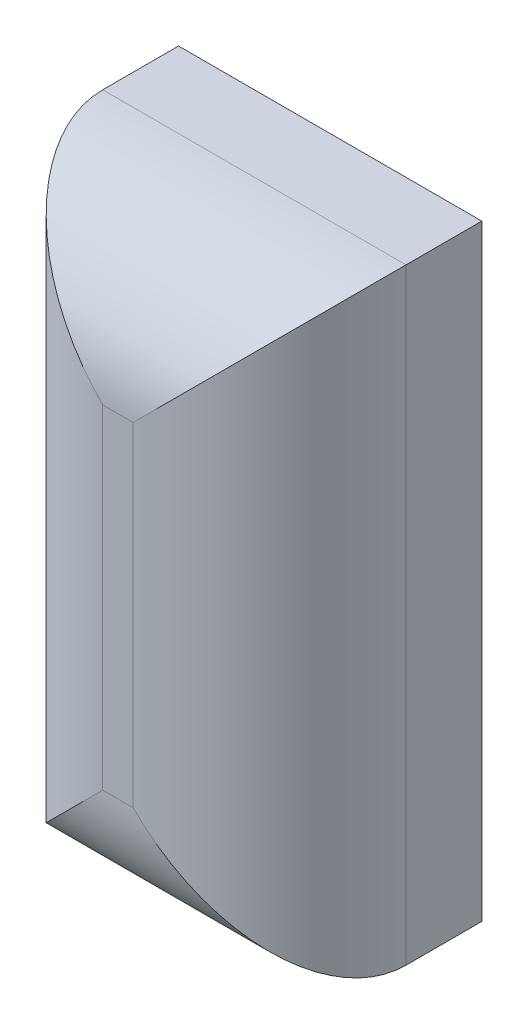
ISO-10303-21;
HEADER;
FILE_DESCRIPTION(('STEP AP214'),'2;1');
FILE_NAME('part.step','',(''),(''),'','','');
FILE_SCHEMA(('AUTOMOTIVE_DESIGN { 1 0 10303 214 1 1 1 1 }'));
ENDSEC;
DATA;
#1=APPLICATION_CONTEXT('core data for automotive mechanical design processes');
#2=APPLICATION_PROTOCOL_DEFINITION('international standard','automotive_design',2000,#1);
#3=PRODUCT_CONTEXT('',#1,'mechanical');
#4=PRODUCT('Part','Part','',(#3));
#5=PRODUCT_RELATED_PRODUCT_CATEGORY('part','',(#4));
#6=PRODUCT_DEFINITION_FORMATION('','',#4);
#7=PRODUCT_DEFINITION_CONTEXT('part definition',#1,'design');
#8=PRODUCT_DEFINITION('design','',#6,#7);
#9=PRODUCT_DEFINITION_SHAPE('','',#8);
#10=(LENGTH_UNIT() NAMED_UNIT(*) SI_UNIT(.MILLI.,.METRE.));
#11=(NAMED_UNIT(*) PLANE_ANGLE_UNIT() SI_UNIT($,.RADIAN.));
#12=(NAMED_UNIT(*) SI_UNIT($,.STERADIAN.) SOLID_ANGLE_UNIT());
#13=UNCERTAINTY_MEASURE_WITH_UNIT(LENGTH_MEASURE(1.E-05),#10,'distance_accuracy_value','');
#14=(GEOMETRIC_REPRESENTATION_CONTEXT(3) GLOBAL_UNCERTAINTY_ASSIGNED_CONTEXT((#13)) GLOBAL_UNIT_ASSIGNED_CONTEXT((#10,
#11,#12)) REPRESENTATION_CONTEXT('',''));
#15=CARTESIAN_POINT('',(0.,0.,0.));
#16=DIRECTION('',(0.,0.,1.));
#17=DIRECTION('',(1.,0.,0.));
#18=AXIS2_PLACEMENT_3D('',#15,#16,#17);
#19=CARTESIAN_POINT('',(0.,-19.5,40.3606367334853));
#20=DIRECTION('',(1.,0.,0.));
#21=DIRECTION('',(0.,1.,0.));
#22=AXIS2_PLACEMENT_3D('',#19,#20,#21);
#23=CYLINDRICAL_SURFACE('',#22,4.5);
#24=CARTESIAN_POINT('',(264.5,-19.5,40.3606367334853));
#25=DIRECTION('',(0.707106781186548,0.707106781186547,0.));
#26=DIRECTION('',(-0.707106781186547,0.707106781186548,0.));
#27=AXIS2_PLACEMENT_3D('',#24,#25,#26);
#28=ELLIPSE('',#27,6.36396103067893,4.5);
#29=CARTESIAN_POINT('',(264.5,-19.5,44.8606367334853));
#30=VERTEX_POINT('',#29);
#31=CARTESIAN_POINT('',(260.,-15.,40.3606367334853));
#32=VERTEX_POINT('',#31);
#33=EDGE_CURVE('E11',#30,#32,#28,.F.);
#34=ORIENTED_EDGE('',*,*,#33,.F.);
#35=DIRECTION('',(-1.,0.,0.));
#36=VECTOR('',#35,1.);
#37=CARTESIAN_POINT('',(0.,-19.5,44.8606367334853));
#38=LINE('',#37,#36);
#39=CARTESIAN_POINT('',(265.5,-19.5,44.8606367334853));
#40=VERTEX_POINT('',#39);
#41=EDGE_CURVE('E107',#40,#30,#38,.T.);
#42=ORIENTED_EDGE('',*,*,#41,.F.);
#43=CARTESIAN_POINT('',(265.5,-19.5,40.3606367334853));
#44=DIRECTION('',(0.707106781186547,-0.707106781186548,0.));
#45=DIRECTION('',(0.707106781186548,0.707106781186547,0.));
#46=AXIS2_PLACEMENT_3D('',#43,#44,#45);
#47=ELLIPSE('',#46,6.36396103067893,4.5);
#48=CARTESIAN_POINT('',(270.,-15.,40.3606367334853));
#49=VERTEX_POINT('',#48);
#50=EDGE_CURVE('E49',#40,#49,#47,.F.);
#51=ORIENTED_EDGE('',*,*,#50,.T.);
#52=DIRECTION('',(-1.,0.,0.));
#53=VECTOR('',#52,1.);
#54=CARTESIAN_POINT('',(0.,-15.,40.3606367334853));
#55=LINE('',#54,#53);
#56=EDGE_CURVE('E147',#32,#49,#55,.F.);
#57=ORIENTED_EDGE('',*,*,#56,.F.);
#58=EDGE_LOOP('',(#34,#42,#51,#57));
#59=FACE_BOUND('',#58,.T.);
#60=ADVANCED_FACE('F42',(#59),#23,.T.);
#61=CARTESIAN_POINT('',(265.5,0.,40.3606367334853));
#62=DIRECTION('',(0.,-1.,0.));
#63=DIRECTION('',(0.,0.,-1.));
#64=AXIS2_PLACEMENT_3D('',#61,#62,#63);
#65=CYLINDRICAL_SURFACE('',#64,4.5);
#66=ORIENTED_EDGE('',*,*,#50,.F.);
#67=DIRECTION('',(0.,1.,0.));
#68=VECTOR('',#67,1.);
#69=CARTESIAN_POINT('',(265.5,0.,44.8606367334853));
#70=LINE('',#69,#68);
#71=CARTESIAN_POINT('',(265.5,-30.5,44.8606367334853));
#72=VERTEX_POINT('',#71);
#73=EDGE_CURVE('E133',#72,#40,#70,.T.);
#74=ORIENTED_EDGE('',*,*,#73,.F.);
#75=CARTESIAN_POINT('',(265.5,-30.5,40.3606367334853));
#76=DIRECTION('',(-0.707106781186548,-0.707106781186547,0.));
#77=DIRECTION('',(0.707106781186547,-0.707106781186548,0.));
#78=AXIS2_PLACEMENT_3D('',#75,#76,#77);
#79=ELLIPSE('',#78,6.36396103067893,4.5);
#80=CARTESIAN_POINT('',(270.,-35.,40.3606367334853));
#81=VERTEX_POINT('',#80);
#82=EDGE_CURVE('E63',#72,#81,#79,.F.);
#83=ORIENTED_EDGE('',*,*,#82,.T.);
#84=DIRECTION('',(0.,1.,0.));
#85=VECTOR('',#84,1.);
#86=CARTESIAN_POINT('',(270.,0.,40.3606367334853));
#87=LINE('',#86,#85);
#88=EDGE_CURVE('E145',#49,#81,#87,.F.);
#89=ORIENTED_EDGE('',*,*,#88,.F.);
#90=EDGE_LOOP('',(#66,#74,#83,#89));
#91=FACE_BOUND('',#90,.T.);
#92=ADVANCED_FACE('F164',(#91),#65,.T.);
#93=CARTESIAN_POINT('',(0.,-30.4999999999998,40.3606367334853));
#94=DIRECTION('',(-1.,0.,0.));
#95=DIRECTION('',(0.,-1.,0.));
#96=AXIS2_PLACEMENT_3D('',#93,#94,#95);
#97=CYLINDRICAL_SURFACE('',#96,4.5);
#98=ORIENTED_EDGE('',*,*,#82,.F.);
#99=DIRECTION('',(1.,0.,0.));
#100=VECTOR('',#99,1.);
#101=CARTESIAN_POINT('',(0.,-30.4999999999998,44.8606367334853));
#102=LINE('',#101,#100);
#103=CARTESIAN_POINT('',(264.5,-30.5,44.8606367334853));
#104=VERTEX_POINT('',#103);
#105=EDGE_CURVE('E136',#104,#72,#102,.T.);
#106=ORIENTED_EDGE('',*,*,#105,.F.);
#107=CARTESIAN_POINT('',(264.5,-30.5,40.3606367334853));
#108=DIRECTION('',(-0.707106781186547,0.707106781186548,0.));
#109=DIRECTION('',(-0.707106781186548,-0.707106781186547,0.));
#110=AXIS2_PLACEMENT_3D('',#107,#108,#109);
#111=ELLIPSE('',#110,6.36396103067892,4.5);
#112=CARTESIAN_POINT('',(260.,-35.,40.3606367334853));
#113=VERTEX_POINT('',#112);
#114=EDGE_CURVE('E149',#104,#113,#111,.F.);
#115=ORIENTED_EDGE('',*,*,#114,.T.);
#116=DIRECTION('',(1.,0.,0.));
#117=VECTOR('',#116,1.);
#118=CARTESIAN_POINT('',(0.,-34.9999999999998,40.3606367334853));
#119=LINE('',#118,#117);
#120=EDGE_CURVE('E102',#81,#113,#119,.F.);
#121=ORIENTED_EDGE('',*,*,#120,.F.);
#122=EDGE_LOOP('',(#98,#106,#115,#121));
#123=FACE_BOUND('',#122,.T.);
#124=ADVANCED_FACE('F153',(#123),#97,.T.);
#125=CARTESIAN_POINT('',(264.5,0.,40.3606367334853));
#126=DIRECTION('',(0.,1.,0.));
#127=DIRECTION('',(0.,0.,1.));
#128=AXIS2_PLACEMENT_3D('',#125,#126,#127);
#129=CYLINDRICAL_SURFACE('',#128,4.5);
#130=DIRECTION('',(0.,-1.,0.));
#131=VECTOR('',#130,1.);
#132=CARTESIAN_POINT('',(264.5,0.,44.8606367334853));
#133=LINE('',#132,#131);
#134=EDGE_CURVE('E139',#30,#104,#133,.T.);
#135=ORIENTED_EDGE('',*,*,#134,.F.);
#136=ORIENTED_EDGE('',*,*,#33,.T.);
#137=DIRECTION('',(0.,-1.,0.));
#138=VECTOR('',#137,1.);
#139=CARTESIAN_POINT('',(260.,0.,40.3606367334853));
#140=LINE('',#139,#138);
#141=EDGE_CURVE('E142',#113,#32,#140,.F.);
#142=ORIENTED_EDGE('',*,*,#141,.F.);
#143=ORIENTED_EDGE('',*,*,#114,.F.);
#144=EDGE_LOOP('',(#135,#136,#142,#143));
#145=FACE_BOUND('',#144,.T.);
#146=ADVANCED_FACE('F156',(#145),#129,.T.);
#147=CARTESIAN_POINT('',(260.,-15.,44.8606367334853));
#148=DIRECTION('',(1.,0.,0.));
#149=DIRECTION('',(0.,0.,-1.));
#150=AXIS2_PLACEMENT_3D('',#147,#148,#149);
#151=PLANE('',#150);
#152=DIRECTION('',(0.,0.,-1.));
#153=VECTOR('',#152,1.);
#154=CARTESIAN_POINT('',(260.,-35.,44.8606367334853));
#155=LINE('',#154,#153);
#156=CARTESIAN_POINT('',(260.,-35.,37.8606367334853));
#157=VERTEX_POINT('',#156);
#158=EDGE_CURVE('E95',#113,#157,#155,.T.);
#159=ORIENTED_EDGE('',*,*,#158,.F.);
#160=ORIENTED_EDGE('',*,*,#141,.T.);
#161=DIRECTION('',(0.,0.,-1.));
#162=VECTOR('',#161,1.);
#163=CARTESIAN_POINT('',(260.,-15.,44.8606367334853));
#164=LINE('',#163,#162);
#165=CARTESIAN_POINT('',(260.,-15.,37.8606367334853));
#166=VERTEX_POINT('',#165);
#167=EDGE_CURVE('E120',#32,#166,#164,.T.);
#168=ORIENTED_EDGE('',*,*,#167,.T.);
#169=DIRECTION('',(0.,-1.,0.));
#170=VECTOR('',#169,1.);
#171=CARTESIAN_POINT('',(260.,-15.,37.8606367334853));
#172=LINE('',#171,#170);
#173=EDGE_CURVE('E114',#166,#157,#172,.T.);
#174=ORIENTED_EDGE('',*,*,#173,.T.);
#175=EDGE_LOOP('',(#159,#160,#168,#174));
#176=FACE_BOUND('',#175,.T.);
#177=ADVANCED_FACE('F118',(#176),#151,.F.);
#178=CARTESIAN_POINT('',(260.,-35.,44.8606367334853));
#179=DIRECTION('',(0.,1.,0.));
#180=DIRECTION('',(-1.,0.,0.));
#181=AXIS2_PLACEMENT_3D('',#178,#179,#180);
#182=PLANE('',#181);
#183=DIRECTION('',(0.,0.,-1.));
#184=VECTOR('',#183,1.);
#185=CARTESIAN_POINT('',(270.,-35.,44.8606367334853));
#186=LINE('',#185,#184);
#187=CARTESIAN_POINT('',(270.,-35.,37.8606367334853));
#188=VERTEX_POINT('',#187);
#189=EDGE_CURVE('E108',#81,#188,#186,.T.);
#190=ORIENTED_EDGE('',*,*,#189,.F.);
#191=ORIENTED_EDGE('',*,*,#120,.T.);
#192=ORIENTED_EDGE('',*,*,#158,.T.);
#193=DIRECTION('',(1.,0.,0.));
#194=VECTOR('',#193,1.);
#195=CARTESIAN_POINT('',(260.,-35.,37.8606367334853));
#196=LINE('',#195,#194);
#197=EDGE_CURVE('E99',#157,#188,#196,.T.);
#198=ORIENTED_EDGE('',*,*,#197,.T.);
#199=EDGE_LOOP('',(#190,#191,#192,#198));
#200=FACE_BOUND('',#199,.T.);
#201=ADVANCED_FACE('F98',(#200),#182,.F.);
#202=CARTESIAN_POINT('',(270.,-15.,44.8606367334853));
#203=DIRECTION('',(-1.,0.,0.));
#204=DIRECTION('',(0.,0.,1.));
#205=AXIS2_PLACEMENT_3D('',#202,#203,#204);
#206=PLANE('',#205);
#207=DIRECTION('',(0.,0.,-1.));
#208=VECTOR('',#207,1.);
#209=CARTESIAN_POINT('',(270.,-15.,44.8606367334853));
#210=LINE('',#209,#208);
#211=CARTESIAN_POINT('',(270.,-15.,37.8606367334853));
#212=VERTEX_POINT('',#211);
#213=EDGE_CURVE('E128',#49,#212,#210,.T.);
#214=ORIENTED_EDGE('',*,*,#213,.F.);
#215=ORIENTED_EDGE('',*,*,#88,.T.);
#216=ORIENTED_EDGE('',*,*,#189,.T.);
#217=DIRECTION('',(0.,1.,0.));
#218=VECTOR('',#217,1.);
#219=CARTESIAN_POINT('',(270.,-15.,37.8606367334853));
#220=LINE('',#219,#218);
#221=EDGE_CURVE('E116',#188,#212,#220,.T.);
#222=ORIENTED_EDGE('',*,*,#221,.T.);
#223=EDGE_LOOP('',(#214,#215,#216,#222));
#224=FACE_BOUND('',#223,.T.);
#225=ADVANCED_FACE('F163',(#224),#206,.F.);
#226=CARTESIAN_POINT('',(260.,-15.,44.8606367334853));
#227=DIRECTION('',(0.,-1.,0.));
#228=DIRECTION('',(1.,0.,0.));
#229=AXIS2_PLACEMENT_3D('',#226,#227,#228);
#230=PLANE('',#229);
#231=ORIENTED_EDGE('',*,*,#167,.F.);
#232=ORIENTED_EDGE('',*,*,#56,.T.);
#233=ORIENTED_EDGE('',*,*,#213,.T.);
#234=DIRECTION('',(-1.,0.,0.));
#235=VECTOR('',#234,1.);
#236=CARTESIAN_POINT('',(260.,-15.,37.8606367334853));
#237=LINE('',#236,#235);
#238=EDGE_CURVE('E125',#212,#166,#237,.T.);
#239=ORIENTED_EDGE('',*,*,#238,.T.);
#240=EDGE_LOOP('',(#231,#232,#233,#239));
#241=FACE_BOUND('',#240,.T.);
#242=ADVANCED_FACE('F160',(#241),#230,.F.);
#243=CARTESIAN_POINT('',(0.,0.,44.8606367334853));
#244=DIRECTION('',(0.,0.,1.));
#245=DIRECTION('',(1.,0.,0.));
#246=AXIS2_PLACEMENT_3D('',#243,#244,#245);
#247=PLANE('',#246);
#248=ORIENTED_EDGE('',*,*,#41,.T.);
#249=ORIENTED_EDGE('',*,*,#134,.T.);
#250=ORIENTED_EDGE('',*,*,#105,.T.);
#251=ORIENTED_EDGE('',*,*,#73,.T.);
#252=EDGE_LOOP('',(#248,#249,#250,#251));
#253=FACE_BOUND('',#252,.T.);
#254=ADVANCED_FACE('F158',(#253),#247,.T.);
#255=CARTESIAN_POINT('',(0.,0.,37.8606367334853));
#256=DIRECTION('',(0.,0.,1.));
#257=DIRECTION('',(1.,0.,0.));
#258=AXIS2_PLACEMENT_3D('',#255,#256,#257);
#259=PLANE('',#258);
#260=ORIENTED_EDGE('',*,*,#173,.F.);
#261=ORIENTED_EDGE('',*,*,#238,.F.);
#262=ORIENTED_EDGE('',*,*,#221,.F.);
#263=ORIENTED_EDGE('',*,*,#197,.F.);
#264=EDGE_LOOP('',(#260,#261,#262,#263));
#265=FACE_BOUND('',#264,.T.);
#266=ADVANCED_FACE('F112',(#265),#259,.F.);
#267=CLOSED_SHELL('',(#60,#92,#124,#146,#177,#201,#225,#242,#254,#266));
#268=MANIFOLD_SOLID_BREP('B2',#267);
#269=ADVANCED_BREP_SHAPE_REPRESENTATION('',(#18,#268),#14);
#270=SHAPE_DEFINITION_REPRESENTATION(#9,#269);
ENDSEC;
END-ISO-10303-21;
